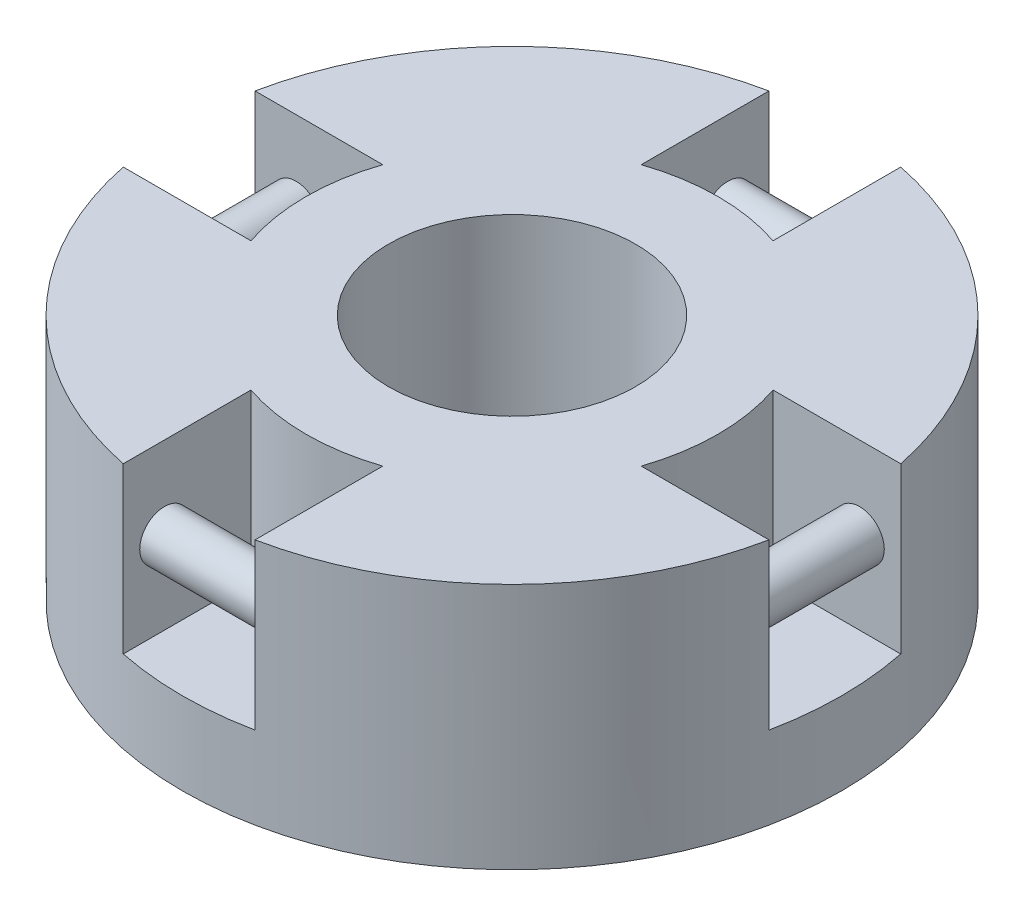
ISO-10303-21;
HEADER;
FILE_DESCRIPTION(('STEP AP214'),'2;1');
FILE_NAME('part.step','',(''),(''),'','','');
FILE_SCHEMA(('AUTOMOTIVE_DESIGN { 1 0 10303 214 1 1 1 1 }'));
ENDSEC;
DATA;
#1=APPLICATION_CONTEXT('core data for automotive mechanical design processes');
#2=APPLICATION_PROTOCOL_DEFINITION('international standard','automotive_design',2000,#1);
#3=PRODUCT_CONTEXT('',#1,'mechanical');
#4=PRODUCT('Part','Part','',(#3));
#5=PRODUCT_RELATED_PRODUCT_CATEGORY('part','',(#4));
#6=PRODUCT_DEFINITION_FORMATION('','',#4);
#7=PRODUCT_DEFINITION_CONTEXT('part definition',#1,'design');
#8=PRODUCT_DEFINITION('design','',#6,#7);
#9=PRODUCT_DEFINITION_SHAPE('','',#8);
#10=(LENGTH_UNIT() NAMED_UNIT(*) SI_UNIT(.MILLI.,.METRE.));
#11=(NAMED_UNIT(*) PLANE_ANGLE_UNIT() SI_UNIT($,.RADIAN.));
#12=(NAMED_UNIT(*) SI_UNIT($,.STERADIAN.) SOLID_ANGLE_UNIT());
#13=UNCERTAINTY_MEASURE_WITH_UNIT(LENGTH_MEASURE(1.E-05),#10,'distance_accuracy_value','');
#14=(GEOMETRIC_REPRESENTATION_CONTEXT(3) GLOBAL_UNCERTAINTY_ASSIGNED_CONTEXT((#13)) GLOBAL_UNIT_ASSIGNED_CONTEXT((#10,
#11,#12)) REPRESENTATION_CONTEXT('',''));
#15=CARTESIAN_POINT('',(0.,0.,0.));
#16=DIRECTION('',(0.,0.,1.));
#17=DIRECTION('',(1.,0.,0.));
#18=AXIS2_PLACEMENT_3D('',#15,#16,#17);
#19=CARTESIAN_POINT('',(0.,15.,0.));
#20=DIRECTION('',(0.,1.,0.));
#21=DIRECTION('',(0.,0.,1.));
#22=AXIS2_PLACEMENT_3D('',#19,#20,#21);
#23=PLANE('',#22);
#24=DIRECTION('',(0.,0.,-1.));
#25=VECTOR('',#24,1.);
#26=CARTESIAN_POINT('',(4.,15.,-19.5959179422654));
#27=LINE('',#26,#25);
#28=CARTESIAN_POINT('',(4.00000000000001,15.,-11.842719282327));
#29=VERTEX_POINT('',#28);
#30=CARTESIAN_POINT('',(4.,15.,-19.5959179422654));
#31=VERTEX_POINT('',#30);
#32=EDGE_CURVE('E168',#29,#31,#27,.T.);
#33=ORIENTED_EDGE('',*,*,#32,.F.);
#34=CARTESIAN_POINT('',(0.,15.,0.));
#35=DIRECTION('',(0.,-1.,0.));
#36=DIRECTION('',(0.,0.,1.));
#37=AXIS2_PLACEMENT_3D('',#34,#35,#36);
#38=CIRCLE('',#37,12.5);
#39=CARTESIAN_POINT('',(-3.99999999999999,15.,-11.842719282327));
#40=VERTEX_POINT('',#39);
#41=EDGE_CURVE('E574',#40,#29,#38,.T.);
#42=ORIENTED_EDGE('',*,*,#41,.F.);
#43=DIRECTION('',(0.,0.,1.));
#44=VECTOR('',#43,1.);
#45=CARTESIAN_POINT('',(-4.,15.,-19.5959179422654));
#46=LINE('',#45,#44);
#47=CARTESIAN_POINT('',(-4.,15.,-19.5959179422654));
#48=VERTEX_POINT('',#47);
#49=EDGE_CURVE('E201',#48,#40,#46,.T.);
#50=ORIENTED_EDGE('',*,*,#49,.F.);
#51=CARTESIAN_POINT('',(0.,15.,0.));
#52=DIRECTION('',(0.,1.,0.));
#53=DIRECTION('',(0.,0.,1.));
#54=AXIS2_PLACEMENT_3D('',#51,#52,#53);
#55=CIRCLE('',#54,20.);
#56=CARTESIAN_POINT('',(-19.5959179422654,15.,-4.));
#57=VERTEX_POINT('',#56);
#58=EDGE_CURVE('E174',#48,#57,#55,.T.);
#59=ORIENTED_EDGE('',*,*,#58,.T.);
#60=DIRECTION('',(-1.,0.,0.));
#61=VECTOR('',#60,1.);
#62=CARTESIAN_POINT('',(-19.5959179422654,15.,-4.));
#63=LINE('',#62,#61);
#64=CARTESIAN_POINT('',(-11.842719282327,15.,-4.));
#65=VERTEX_POINT('',#64);
#66=EDGE_CURVE('E184',#65,#57,#63,.T.);
#67=ORIENTED_EDGE('',*,*,#66,.F.);
#68=CARTESIAN_POINT('',(0.,15.,0.));
#69=DIRECTION('',(0.,-1.,0.));
#70=DIRECTION('',(0.,0.,1.));
#71=AXIS2_PLACEMENT_3D('',#68,#69,#70);
#72=CIRCLE('',#71,12.5);
#73=CARTESIAN_POINT('',(-11.842719282327,15.,4.));
#74=VERTEX_POINT('',#73);
#75=EDGE_CURVE('E194',#74,#65,#72,.T.);
#76=ORIENTED_EDGE('',*,*,#75,.F.);
#77=DIRECTION('',(1.,0.,0.));
#78=VECTOR('',#77,1.);
#79=CARTESIAN_POINT('',(-19.5959179422654,15.,4.));
#80=LINE('',#79,#78);
#81=CARTESIAN_POINT('',(-19.5959179422654,15.,4.));
#82=VERTEX_POINT('',#81);
#83=EDGE_CURVE('E191',#82,#74,#80,.T.);
#84=ORIENTED_EDGE('',*,*,#83,.F.);
#85=CARTESIAN_POINT('',(-4.,15.,19.5959179422654));
#86=VERTEX_POINT('',#85);
#87=EDGE_CURVE('E275',#82,#86,#55,.T.);
#88=ORIENTED_EDGE('',*,*,#87,.T.);
#89=DIRECTION('',(0.,0.,1.));
#90=VECTOR('',#89,1.);
#91=CARTESIAN_POINT('',(-3.99999999999999,15.,11.842719282327));
#92=LINE('',#91,#90);
#93=CARTESIAN_POINT('',(-3.99999999999999,15.,11.842719282327));
#94=VERTEX_POINT('',#93);
#95=EDGE_CURVE('E211',#94,#86,#92,.T.);
#96=ORIENTED_EDGE('',*,*,#95,.F.);
#97=CARTESIAN_POINT('',(0.,15.,0.));
#98=DIRECTION('',(0.,-1.,0.));
#99=DIRECTION('',(0.,0.,1.));
#100=AXIS2_PLACEMENT_3D('',#97,#98,#99);
#101=CIRCLE('',#100,12.5);
#102=CARTESIAN_POINT('',(4.,15.,11.842719282327));
#103=VERTEX_POINT('',#102);
#104=EDGE_CURVE('E223',#103,#94,#101,.T.);
#105=ORIENTED_EDGE('',*,*,#104,.F.);
#106=DIRECTION('',(0.,0.,-1.));
#107=VECTOR('',#106,1.);
#108=CARTESIAN_POINT('',(4.00000000000001,15.,11.842719282327));
#109=LINE('',#108,#107);
#110=CARTESIAN_POINT('',(4.,15.,19.5959179422654));
#111=VERTEX_POINT('',#110);
#112=EDGE_CURVE('E220',#111,#103,#109,.T.);
#113=ORIENTED_EDGE('',*,*,#112,.F.);
#114=CARTESIAN_POINT('',(19.5959179422654,15.,4.));
#115=VERTEX_POINT('',#114);
#116=EDGE_CURVE('E270',#111,#115,#55,.T.);
#117=ORIENTED_EDGE('',*,*,#116,.T.);
#118=DIRECTION('',(1.,0.,0.));
#119=VECTOR('',#118,1.);
#120=CARTESIAN_POINT('',(11.842719282327,15.,4.));
#121=LINE('',#120,#119);
#122=CARTESIAN_POINT('',(11.842719282327,15.,4.));
#123=VERTEX_POINT('',#122);
#124=EDGE_CURVE('E239',#123,#115,#121,.T.);
#125=ORIENTED_EDGE('',*,*,#124,.F.);
#126=CARTESIAN_POINT('',(0.,15.,0.));
#127=DIRECTION('',(0.,-1.,0.));
#128=DIRECTION('',(0.,0.,1.));
#129=AXIS2_PLACEMENT_3D('',#126,#127,#128);
#130=CIRCLE('',#129,12.5);
#131=CARTESIAN_POINT('',(11.842719282327,15.,-4.));
#132=VERTEX_POINT('',#131);
#133=EDGE_CURVE('E251',#132,#123,#130,.T.);
#134=ORIENTED_EDGE('',*,*,#133,.F.);
#135=DIRECTION('',(-1.,0.,0.));
#136=VECTOR('',#135,1.);
#137=CARTESIAN_POINT('',(11.842719282327,15.,-4.));
#138=LINE('',#137,#136);
#139=CARTESIAN_POINT('',(19.5959179422654,15.,-4.));
#140=VERTEX_POINT('',#139);
#141=EDGE_CURVE('E248',#140,#132,#138,.T.);
#142=ORIENTED_EDGE('',*,*,#141,.F.);
#143=EDGE_CURVE('E274',#140,#31,#55,.T.);
#144=ORIENTED_EDGE('',*,*,#143,.T.);
#145=EDGE_LOOP('',(#33,#42,#50,#59,#67,#76,#84,#88,#96,#105,#113,#117,#125,#134,#142,#144));
#146=FACE_BOUND('',#145,.T.);
#147=CARTESIAN_POINT('',(0.,15.,0.));
#148=DIRECTION('',(0.,1.,0.));
#149=DIRECTION('',(0.,0.,1.));
#150=AXIS2_PLACEMENT_3D('',#147,#148,#149);
#151=CIRCLE('',#150,7.5);
#152=CARTESIAN_POINT('',(0.,15.,7.5));
#153=VERTEX_POINT('',#152);
#154=EDGE_CURVE('E262',#153,#153,#151,.T.);
#155=ORIENTED_EDGE('',*,*,#154,.F.);
#156=EDGE_LOOP('',(#155));
#157=FACE_BOUND('',#156,.T.);
#158=ADVANCED_FACE('F37',(#146,#157),#23,.T.);
#159=CARTESIAN_POINT('',(0.,0.,0.));
#160=DIRECTION('',(0.,1.,0.));
#161=DIRECTION('',(0.,0.,1.));
#162=AXIS2_PLACEMENT_3D('',#159,#160,#161);
#163=PLANE('',#162);
#164=CARTESIAN_POINT('',(0.,0.,0.));
#165=DIRECTION('',(0.,1.,0.));
#166=DIRECTION('',(0.,0.,1.));
#167=AXIS2_PLACEMENT_3D('',#164,#165,#166);
#168=CIRCLE('',#167,20.);
#169=CARTESIAN_POINT('',(0.,0.,20.));
#170=VERTEX_POINT('',#169);
#171=EDGE_CURVE('E265',#170,#170,#168,.T.);
#172=ORIENTED_EDGE('',*,*,#171,.F.);
#173=EDGE_LOOP('',(#172));
#174=FACE_BOUND('',#173,.T.);
#175=CARTESIAN_POINT('',(0.,0.,0.));
#176=DIRECTION('',(0.,1.,0.));
#177=DIRECTION('',(0.,0.,1.));
#178=AXIS2_PLACEMENT_3D('',#175,#176,#177);
#179=CIRCLE('',#178,7.5);
#180=CARTESIAN_POINT('',(0.,0.,7.5));
#181=VERTEX_POINT('',#180);
#182=EDGE_CURVE('E266',#181,#181,#179,.T.);
#183=ORIENTED_EDGE('',*,*,#182,.T.);
#184=EDGE_LOOP('',(#183));
#185=FACE_BOUND('',#184,.T.);
#186=ADVANCED_FACE('F358',(#174,#185),#163,.F.);
#187=CARTESIAN_POINT('',(0.,15.,0.));
#188=DIRECTION('',(0.,-1.,0.));
#189=DIRECTION('',(0.,0.,-1.));
#190=AXIS2_PLACEMENT_3D('',#187,#188,#189);
#191=CYLINDRICAL_SURFACE('',#190,20.);
#192=CARTESIAN_POINT('',(0.,5.,0.));
#193=DIRECTION('',(0.,1.,0.));
#194=DIRECTION('',(0.,0.,1.));
#195=AXIS2_PLACEMENT_3D('',#192,#193,#194);
#196=CIRCLE('',#195,20.);
#197=CARTESIAN_POINT('',(4.,5.,-19.5959179422654));
#198=VERTEX_POINT('',#197);
#199=CARTESIAN_POINT('',(-4.,5.,-19.5959179422654));
#200=VERTEX_POINT('',#199);
#201=EDGE_CURVE('E162',#198,#200,#196,.T.);
#202=ORIENTED_EDGE('',*,*,#201,.F.);
#203=DIRECTION('',(0.,1.,0.));
#204=VECTOR('',#203,1.);
#205=CARTESIAN_POINT('',(4.,5.,-19.5959179422654));
#206=LINE('',#205,#204);
#207=EDGE_CURVE('E269',#198,#31,#206,.T.);
#208=ORIENTED_EDGE('',*,*,#207,.T.);
#209=ORIENTED_EDGE('',*,*,#143,.F.);
#210=DIRECTION('',(0.,1.,0.));
#211=VECTOR('',#210,1.);
#212=CARTESIAN_POINT('',(19.5959179422654,5.,-4.));
#213=LINE('',#212,#211);
#214=CARTESIAN_POINT('',(19.5959179422654,5.,-4.));
#215=VERTEX_POINT('',#214);
#216=EDGE_CURVE('E247',#215,#140,#213,.T.);
#217=ORIENTED_EDGE('',*,*,#216,.F.);
#218=CARTESIAN_POINT('',(0.,5.,0.));
#219=DIRECTION('',(0.,1.,0.));
#220=DIRECTION('',(0.,0.,1.));
#221=AXIS2_PLACEMENT_3D('',#218,#219,#220);
#222=CIRCLE('',#221,20.);
#223=CARTESIAN_POINT('',(19.5959179422654,5.,4.));
#224=VERTEX_POINT('',#223);
#225=EDGE_CURVE('E235',#224,#215,#222,.T.);
#226=ORIENTED_EDGE('',*,*,#225,.F.);
#227=DIRECTION('',(0.,1.,0.));
#228=VECTOR('',#227,1.);
#229=CARTESIAN_POINT('',(19.5959179422654,5.,4.));
#230=LINE('',#229,#228);
#231=EDGE_CURVE('E224',#224,#115,#230,.T.);
#232=ORIENTED_EDGE('',*,*,#231,.T.);
#233=ORIENTED_EDGE('',*,*,#116,.F.);
#234=DIRECTION('',(0.,1.,0.));
#235=VECTOR('',#234,1.);
#236=CARTESIAN_POINT('',(4.,5.,19.5959179422654));
#237=LINE('',#236,#235);
#238=CARTESIAN_POINT('',(4.,5.,19.5959179422654));
#239=VERTEX_POINT('',#238);
#240=EDGE_CURVE('E219',#239,#111,#237,.T.);
#241=ORIENTED_EDGE('',*,*,#240,.F.);
#242=CARTESIAN_POINT('',(0.,5.,0.));
#243=DIRECTION('',(0.,1.,0.));
#244=DIRECTION('',(0.,0.,1.));
#245=AXIS2_PLACEMENT_3D('',#242,#243,#244);
#246=CIRCLE('',#245,20.);
#247=CARTESIAN_POINT('',(-4.,5.,19.5959179422654));
#248=VERTEX_POINT('',#247);
#249=EDGE_CURVE('E207',#248,#239,#246,.T.);
#250=ORIENTED_EDGE('',*,*,#249,.F.);
#251=DIRECTION('',(0.,1.,0.));
#252=VECTOR('',#251,1.);
#253=CARTESIAN_POINT('',(-4.,5.,19.5959179422654));
#254=LINE('',#253,#252);
#255=EDGE_CURVE('E195',#248,#86,#254,.T.);
#256=ORIENTED_EDGE('',*,*,#255,.T.);
#257=ORIENTED_EDGE('',*,*,#87,.F.);
#258=DIRECTION('',(0.,1.,0.));
#259=VECTOR('',#258,1.);
#260=CARTESIAN_POINT('',(-19.5959179422654,5.,4.));
#261=LINE('',#260,#259);
#262=CARTESIAN_POINT('',(-19.5959179422654,5.,4.));
#263=VERTEX_POINT('',#262);
#264=EDGE_CURVE('E190',#263,#82,#261,.T.);
#265=ORIENTED_EDGE('',*,*,#264,.F.);
#266=CARTESIAN_POINT('',(0.,5.,0.));
#267=DIRECTION('',(0.,1.,0.));
#268=DIRECTION('',(0.,0.,1.));
#269=AXIS2_PLACEMENT_3D('',#266,#267,#268);
#270=CIRCLE('',#269,20.);
#271=CARTESIAN_POINT('',(-19.5959179422654,5.,-4.));
#272=VERTEX_POINT('',#271);
#273=EDGE_CURVE('E181',#272,#263,#270,.T.);
#274=ORIENTED_EDGE('',*,*,#273,.F.);
#275=DIRECTION('',(0.,1.,0.));
#276=VECTOR('',#275,1.);
#277=CARTESIAN_POINT('',(-19.5959179422654,5.,-4.));
#278=LINE('',#277,#276);
#279=EDGE_CURVE('E199',#272,#57,#278,.T.);
#280=ORIENTED_EDGE('',*,*,#279,.T.);
#281=ORIENTED_EDGE('',*,*,#58,.F.);
#282=DIRECTION('',(0.,1.,0.));
#283=VECTOR('',#282,1.);
#284=CARTESIAN_POINT('',(-4.,5.,-19.5959179422654));
#285=LINE('',#284,#283);
#286=EDGE_CURVE('E157',#200,#48,#285,.T.);
#287=ORIENTED_EDGE('',*,*,#286,.F.);
#288=EDGE_LOOP('',(#202,#208,#209,#217,#226,#232,#233,#241,#250,#256,#257,#265,#274,#280,#281,#287));
#289=FACE_BOUND('',#288,.T.);
#290=ORIENTED_EDGE('',*,*,#171,.T.);
#291=EDGE_LOOP('',(#290));
#292=FACE_BOUND('',#291,.T.);
#293=ADVANCED_FACE('F39',(#289,#292),#191,.T.);
#294=CARTESIAN_POINT('',(0.,15.,0.));
#295=DIRECTION('',(0.,-1.,0.));
#296=DIRECTION('',(0.,0.,-1.));
#297=AXIS2_PLACEMENT_3D('',#294,#295,#296);
#298=CYLINDRICAL_SURFACE('',#297,7.5);
#299=ORIENTED_EDGE('',*,*,#154,.T.);
#300=EDGE_LOOP('',(#299));
#301=FACE_BOUND('',#300,.T.);
#302=ORIENTED_EDGE('',*,*,#182,.F.);
#303=EDGE_LOOP('',(#302));
#304=FACE_BOUND('',#303,.T.);
#305=ADVANCED_FACE('F365',(#301,#304),#298,.F.);
#306=CARTESIAN_POINT('',(11.842719282327,5.,4.));
#307=DIRECTION('',(0.,0.,1.));
#308=DIRECTION('',(1.,0.,0.));
#309=AXIS2_PLACEMENT_3D('',#306,#307,#308);
#310=PLANE('',#309);
#311=CARTESIAN_POINT('',(17.0959179422654,10.,4.));
#312=DIRECTION('',(0.,0.,1.));
#313=DIRECTION('',(1.,0.,0.));
#314=AXIS2_PLACEMENT_3D('',#311,#312,#313);
#315=CIRCLE('',#314,1.5);
#316=CARTESIAN_POINT('',(18.5959179422654,10.,4.));
#317=VERTEX_POINT('',#316);
#318=EDGE_CURVE('E280',#317,#317,#315,.F.);
#319=ORIENTED_EDGE('',*,*,#318,.F.);
#320=EDGE_LOOP('',(#319));
#321=FACE_BOUND('',#320,.T.);
#322=ORIENTED_EDGE('',*,*,#124,.T.);
#323=ORIENTED_EDGE('',*,*,#231,.F.);
#324=DIRECTION('',(1.,0.,0.));
#325=VECTOR('',#324,1.);
#326=CARTESIAN_POINT('',(11.842719282327,5.,4.));
#327=LINE('',#326,#325);
#328=CARTESIAN_POINT('',(11.842719282327,5.,4.));
#329=VERTEX_POINT('',#328);
#330=EDGE_CURVE('E245',#329,#224,#327,.T.);
#331=ORIENTED_EDGE('',*,*,#330,.F.);
#332=DIRECTION('',(0.,1.,0.));
#333=VECTOR('',#332,1.);
#334=CARTESIAN_POINT('',(11.842719282327,5.,4.));
#335=LINE('',#334,#333);
#336=EDGE_CURVE('E257',#329,#123,#335,.T.);
#337=ORIENTED_EDGE('',*,*,#336,.T.);
#338=EDGE_LOOP('',(#322,#323,#331,#337));
#339=FACE_BOUND('',#338,.T.);
#340=ADVANCED_FACE('F326',(#321,#339),#310,.F.);
#341=CARTESIAN_POINT('',(0.,5.,0.));
#342=DIRECTION('',(0.,1.,0.));
#343=DIRECTION('',(0.,0.,1.));
#344=AXIS2_PLACEMENT_3D('',#341,#342,#343);
#345=CYLINDRICAL_SURFACE('',#344,12.5);
#346=ORIENTED_EDGE('',*,*,#133,.T.);
#347=ORIENTED_EDGE('',*,*,#336,.F.);
#348=CARTESIAN_POINT('',(0.,5.,0.));
#349=DIRECTION('',(0.,-1.,0.));
#350=DIRECTION('',(0.,0.,1.));
#351=AXIS2_PLACEMENT_3D('',#348,#349,#350);
#352=CIRCLE('',#351,12.5);
#353=CARTESIAN_POINT('',(11.842719282327,5.,-4.));
#354=VERTEX_POINT('',#353);
#355=EDGE_CURVE('E242',#354,#329,#352,.T.);
#356=ORIENTED_EDGE('',*,*,#355,.F.);
#357=DIRECTION('',(0.,1.,0.));
#358=VECTOR('',#357,1.);
#359=CARTESIAN_POINT('',(11.842719282327,5.,-4.));
#360=LINE('',#359,#358);
#361=EDGE_CURVE('E259',#354,#132,#360,.T.);
#362=ORIENTED_EDGE('',*,*,#361,.T.);
#363=EDGE_LOOP('',(#346,#347,#356,#362));
#364=FACE_BOUND('',#363,.T.);
#365=ADVANCED_FACE('F330',(#364),#345,.T.);
#366=CARTESIAN_POINT('',(11.842719282327,5.,-4.));
#367=DIRECTION('',(0.,0.,-1.));
#368=DIRECTION('',(-1.,0.,0.));
#369=AXIS2_PLACEMENT_3D('',#366,#367,#368);
#370=PLANE('',#369);
#371=CARTESIAN_POINT('',(17.0959179422654,10.,-4.));
#372=DIRECTION('',(0.,0.,-1.));
#373=DIRECTION('',(-1.,0.,0.));
#374=AXIS2_PLACEMENT_3D('',#371,#372,#373);
#375=CIRCLE('',#374,1.5);
#376=CARTESIAN_POINT('',(15.5959179422654,10.,-4.));
#377=VERTEX_POINT('',#376);
#378=EDGE_CURVE('E273',#377,#377,#375,.F.);
#379=ORIENTED_EDGE('',*,*,#378,.F.);
#380=EDGE_LOOP('',(#379));
#381=FACE_BOUND('',#380,.T.);
#382=ORIENTED_EDGE('',*,*,#141,.T.);
#383=ORIENTED_EDGE('',*,*,#361,.F.);
#384=DIRECTION('',(-1.,0.,0.));
#385=VECTOR('',#384,1.);
#386=CARTESIAN_POINT('',(11.842719282327,5.,-4.));
#387=LINE('',#386,#385);
#388=EDGE_CURVE('E238',#215,#354,#387,.T.);
#389=ORIENTED_EDGE('',*,*,#388,.F.);
#390=ORIENTED_EDGE('',*,*,#216,.T.);
#391=EDGE_LOOP('',(#382,#383,#389,#390));
#392=FACE_BOUND('',#391,.T.);
#393=ADVANCED_FACE('F332',(#381,#392),#370,.F.);
#394=CARTESIAN_POINT('',(0.,5.,0.));
#395=DIRECTION('',(0.,1.,0.));
#396=DIRECTION('',(0.,0.,1.));
#397=AXIS2_PLACEMENT_3D('',#394,#395,#396);
#398=PLANE('',#397);
#399=ORIENTED_EDGE('',*,*,#225,.T.);
#400=ORIENTED_EDGE('',*,*,#388,.T.);
#401=ORIENTED_EDGE('',*,*,#355,.T.);
#402=ORIENTED_EDGE('',*,*,#330,.T.);
#403=EDGE_LOOP('',(#399,#400,#401,#402));
#404=FACE_BOUND('',#403,.T.);
#405=ADVANCED_FACE('F345',(#404),#398,.T.);
#406=CARTESIAN_POINT('',(-3.99999999999999,5.,11.842719282327));
#407=DIRECTION('',(-1.,0.,0.));
#408=DIRECTION('',(0.,0.,1.));
#409=AXIS2_PLACEMENT_3D('',#406,#407,#408);
#410=PLANE('',#409);
#411=CARTESIAN_POINT('',(-4.,10.,17.0959179422655));
#412=DIRECTION('',(-1.,0.,0.));
#413=DIRECTION('',(0.,0.,1.));
#414=AXIS2_PLACEMENT_3D('',#411,#412,#413);
#415=CIRCLE('',#414,1.5);
#416=CARTESIAN_POINT('',(-4.,10.,18.5959179422655));
#417=VERTEX_POINT('',#416);
#418=EDGE_CURVE('E11',#417,#417,#415,.F.);
#419=ORIENTED_EDGE('',*,*,#418,.F.);
#420=EDGE_LOOP('',(#419));
#421=FACE_BOUND('',#420,.T.);
#422=ORIENTED_EDGE('',*,*,#95,.T.);
#423=ORIENTED_EDGE('',*,*,#255,.F.);
#424=DIRECTION('',(0.,0.,1.));
#425=VECTOR('',#424,1.);
#426=CARTESIAN_POINT('',(-3.99999999999999,5.,11.842719282327));
#427=LINE('',#426,#425);
#428=CARTESIAN_POINT('',(-3.99999999999999,5.,11.842719282327));
#429=VERTEX_POINT('',#428);
#430=EDGE_CURVE('E217',#429,#248,#427,.T.);
#431=ORIENTED_EDGE('',*,*,#430,.F.);
#432=DIRECTION('',(0.,1.,0.));
#433=VECTOR('',#432,1.);
#434=CARTESIAN_POINT('',(-3.99999999999999,5.,11.842719282327));
#435=LINE('',#434,#433);
#436=EDGE_CURVE('E230',#429,#94,#435,.T.);
#437=ORIENTED_EDGE('',*,*,#436,.T.);
#438=EDGE_LOOP('',(#422,#423,#431,#437));
#439=FACE_BOUND('',#438,.T.);
#440=ADVANCED_FACE('F343',(#421,#439),#410,.F.);
#441=CARTESIAN_POINT('',(0.,5.,0.));
#442=DIRECTION('',(0.,1.,0.));
#443=DIRECTION('',(0.,0.,1.));
#444=AXIS2_PLACEMENT_3D('',#441,#442,#443);
#445=CYLINDRICAL_SURFACE('',#444,12.5);
#446=ORIENTED_EDGE('',*,*,#104,.T.);
#447=ORIENTED_EDGE('',*,*,#436,.F.);
#448=CARTESIAN_POINT('',(0.,5.,0.));
#449=DIRECTION('',(0.,-1.,0.));
#450=DIRECTION('',(0.,0.,1.));
#451=AXIS2_PLACEMENT_3D('',#448,#449,#450);
#452=CIRCLE('',#451,12.5);
#453=CARTESIAN_POINT('',(4.,5.,11.842719282327));
#454=VERTEX_POINT('',#453);
#455=EDGE_CURVE('E214',#454,#429,#452,.T.);
#456=ORIENTED_EDGE('',*,*,#455,.F.);
#457=DIRECTION('',(0.,1.,0.));
#458=VECTOR('',#457,1.);
#459=CARTESIAN_POINT('',(4.,5.,11.842719282327));
#460=LINE('',#459,#458);
#461=EDGE_CURVE('E232',#454,#103,#460,.T.);
#462=ORIENTED_EDGE('',*,*,#461,.T.);
#463=EDGE_LOOP('',(#446,#447,#456,#462));
#464=FACE_BOUND('',#463,.T.);
#465=ADVANCED_FACE('F303',(#464),#445,.T.);
#466=CARTESIAN_POINT('',(4.00000000000001,5.,11.842719282327));
#467=DIRECTION('',(1.,0.,0.));
#468=DIRECTION('',(0.,0.,-1.));
#469=AXIS2_PLACEMENT_3D('',#466,#467,#468);
#470=PLANE('',#469);
#471=CARTESIAN_POINT('',(4.,10.,17.0959179422654));
#472=DIRECTION('',(1.,0.,0.));
#473=DIRECTION('',(0.,0.,-1.));
#474=AXIS2_PLACEMENT_3D('',#471,#472,#473);
#475=CIRCLE('',#474,1.5);
#476=CARTESIAN_POINT('',(4.,10.,15.5959179422654));
#477=VERTEX_POINT('',#476);
#478=EDGE_CURVE('E45',#477,#477,#475,.F.);
#479=ORIENTED_EDGE('',*,*,#478,.F.);
#480=EDGE_LOOP('',(#479));
#481=FACE_BOUND('',#480,.T.);
#482=ORIENTED_EDGE('',*,*,#112,.T.);
#483=ORIENTED_EDGE('',*,*,#461,.F.);
#484=DIRECTION('',(0.,0.,-1.));
#485=VECTOR('',#484,1.);
#486=CARTESIAN_POINT('',(4.00000000000001,5.,11.842719282327));
#487=LINE('',#486,#485);
#488=EDGE_CURVE('E210',#239,#454,#487,.T.);
#489=ORIENTED_EDGE('',*,*,#488,.F.);
#490=ORIENTED_EDGE('',*,*,#240,.T.);
#491=EDGE_LOOP('',(#482,#483,#489,#490));
#492=FACE_BOUND('',#491,.T.);
#493=ADVANCED_FACE('F299',(#481,#492),#470,.F.);
#494=CARTESIAN_POINT('',(0.,5.,0.));
#495=DIRECTION('',(0.,1.,0.));
#496=DIRECTION('',(0.,0.,1.));
#497=AXIS2_PLACEMENT_3D('',#494,#495,#496);
#498=PLANE('',#497);
#499=ORIENTED_EDGE('',*,*,#249,.T.);
#500=ORIENTED_EDGE('',*,*,#488,.T.);
#501=ORIENTED_EDGE('',*,*,#455,.T.);
#502=ORIENTED_EDGE('',*,*,#430,.T.);
#503=EDGE_LOOP('',(#499,#500,#501,#502));
#504=FACE_BOUND('',#503,.T.);
#505=ADVANCED_FACE('F302',(#504),#498,.T.);
#506=CARTESIAN_POINT('',(-19.5959179422654,5.,-4.));
#507=DIRECTION('',(0.,0.,-1.));
#508=DIRECTION('',(-1.,0.,0.));
#509=AXIS2_PLACEMENT_3D('',#506,#507,#508);
#510=PLANE('',#509);
#511=CARTESIAN_POINT('',(-17.0959179422654,10.,-4.));
#512=DIRECTION('',(0.,0.,-1.));
#513=DIRECTION('',(-1.,0.,0.));
#514=AXIS2_PLACEMENT_3D('',#511,#512,#513);
#515=CIRCLE('',#514,1.5);
#516=CARTESIAN_POINT('',(-18.5959179422654,10.,-4.));
#517=VERTEX_POINT('',#516);
#518=EDGE_CURVE('E292',#517,#517,#515,.F.);
#519=ORIENTED_EDGE('',*,*,#518,.F.);
#520=EDGE_LOOP('',(#519));
#521=FACE_BOUND('',#520,.T.);
#522=ORIENTED_EDGE('',*,*,#66,.T.);
#523=ORIENTED_EDGE('',*,*,#279,.F.);
#524=DIRECTION('',(-1.,0.,0.));
#525=VECTOR('',#524,1.);
#526=CARTESIAN_POINT('',(-19.5959179422654,5.,-4.));
#527=LINE('',#526,#525);
#528=CARTESIAN_POINT('',(-11.842719282327,5.,-4.));
#529=VERTEX_POINT('',#528);
#530=EDGE_CURVE('E60',#529,#272,#527,.T.);
#531=ORIENTED_EDGE('',*,*,#530,.F.);
#532=DIRECTION('',(0.,1.,0.));
#533=VECTOR('',#532,1.);
#534=CARTESIAN_POINT('',(-11.842719282327,5.,-4.));
#535=LINE('',#534,#533);
#536=EDGE_CURVE('E202',#529,#65,#535,.T.);
#537=ORIENTED_EDGE('',*,*,#536,.T.);
#538=EDGE_LOOP('',(#522,#523,#531,#537));
#539=FACE_BOUND('',#538,.T.);
#540=ADVANCED_FACE('F411',(#521,#539),#510,.F.);
#541=CARTESIAN_POINT('',(0.,5.,0.));
#542=DIRECTION('',(0.,1.,0.));
#543=DIRECTION('',(0.,0.,1.));
#544=AXIS2_PLACEMENT_3D('',#541,#542,#543);
#545=CYLINDRICAL_SURFACE('',#544,12.5);
#546=ORIENTED_EDGE('',*,*,#75,.T.);
#547=ORIENTED_EDGE('',*,*,#536,.F.);
#548=CARTESIAN_POINT('',(0.,5.,0.));
#549=DIRECTION('',(0.,-1.,0.));
#550=DIRECTION('',(0.,0.,1.));
#551=AXIS2_PLACEMENT_3D('',#548,#549,#550);
#552=CIRCLE('',#551,12.5);
#553=CARTESIAN_POINT('',(-11.842719282327,5.,4.));
#554=VERTEX_POINT('',#553);
#555=EDGE_CURVE('E187',#554,#529,#552,.T.);
#556=ORIENTED_EDGE('',*,*,#555,.F.);
#557=DIRECTION('',(0.,1.,0.));
#558=VECTOR('',#557,1.);
#559=CARTESIAN_POINT('',(-11.842719282327,5.,4.));
#560=LINE('',#559,#558);
#561=EDGE_CURVE('E204',#554,#74,#560,.T.);
#562=ORIENTED_EDGE('',*,*,#561,.T.);
#563=EDGE_LOOP('',(#546,#547,#556,#562));
#564=FACE_BOUND('',#563,.T.);
#565=ADVANCED_FACE('F414',(#564),#545,.T.);
#566=CARTESIAN_POINT('',(-19.5959179422654,5.,4.));
#567=DIRECTION('',(0.,0.,1.));
#568=DIRECTION('',(1.,0.,0.));
#569=AXIS2_PLACEMENT_3D('',#566,#567,#568);
#570=PLANE('',#569);
#571=CARTESIAN_POINT('',(-17.0959179422654,10.,4.));
#572=DIRECTION('',(0.,0.,1.));
#573=DIRECTION('',(1.,0.,0.));
#574=AXIS2_PLACEMENT_3D('',#571,#572,#573);
#575=CIRCLE('',#574,1.5);
#576=CARTESIAN_POINT('',(-15.5959179422654,10.,4.));
#577=VERTEX_POINT('',#576);
#578=EDGE_CURVE('E289',#577,#577,#575,.F.);
#579=ORIENTED_EDGE('',*,*,#578,.F.);
#580=EDGE_LOOP('',(#579));
#581=FACE_BOUND('',#580,.T.);
#582=ORIENTED_EDGE('',*,*,#83,.T.);
#583=ORIENTED_EDGE('',*,*,#561,.F.);
#584=DIRECTION('',(1.,0.,0.));
#585=VECTOR('',#584,1.);
#586=CARTESIAN_POINT('',(-19.5959179422654,5.,4.));
#587=LINE('',#586,#585);
#588=EDGE_CURVE('E183',#263,#554,#587,.T.);
#589=ORIENTED_EDGE('',*,*,#588,.F.);
#590=ORIENTED_EDGE('',*,*,#264,.T.);
#591=EDGE_LOOP('',(#582,#583,#589,#590));
#592=FACE_BOUND('',#591,.T.);
#593=ADVANCED_FACE('F410',(#581,#592),#570,.F.);
#594=CARTESIAN_POINT('',(0.,5.,0.));
#595=DIRECTION('',(0.,1.,0.));
#596=DIRECTION('',(0.,0.,1.));
#597=AXIS2_PLACEMENT_3D('',#594,#595,#596);
#598=PLANE('',#597);
#599=ORIENTED_EDGE('',*,*,#273,.T.);
#600=ORIENTED_EDGE('',*,*,#588,.T.);
#601=ORIENTED_EDGE('',*,*,#555,.T.);
#602=ORIENTED_EDGE('',*,*,#530,.T.);
#603=EDGE_LOOP('',(#599,#600,#601,#602));
#604=FACE_BOUND('',#603,.T.);
#605=ADVANCED_FACE('F400',(#604),#598,.T.);
#606=CARTESIAN_POINT('',(4.,5.,-19.5959179422654));
#607=DIRECTION('',(1.,0.,0.));
#608=DIRECTION('',(0.,0.,-1.));
#609=AXIS2_PLACEMENT_3D('',#606,#607,#608);
#610=PLANE('',#609);
#611=CARTESIAN_POINT('',(4.,10.,-17.0959179422654));
#612=DIRECTION('',(1.,0.,0.));
#613=DIRECTION('',(0.,0.,-1.));
#614=AXIS2_PLACEMENT_3D('',#611,#612,#613);
#615=CIRCLE('',#614,1.5);
#616=CARTESIAN_POINT('',(4.,10.,-18.5959179422654));
#617=VERTEX_POINT('',#616);
#618=EDGE_CURVE('E286',#617,#617,#615,.F.);
#619=ORIENTED_EDGE('',*,*,#618,.F.);
#620=EDGE_LOOP('',(#619));
#621=FACE_BOUND('',#620,.T.);
#622=ORIENTED_EDGE('',*,*,#32,.T.);
#623=ORIENTED_EDGE('',*,*,#207,.F.);
#624=DIRECTION('',(0.,0.,-1.));
#625=VECTOR('',#624,1.);
#626=CARTESIAN_POINT('',(4.,5.,-19.5959179422654));
#627=LINE('',#626,#625);
#628=CARTESIAN_POINT('',(4.00000000000001,5.,-11.842719282327));
#629=VERTEX_POINT('',#628);
#630=EDGE_CURVE('E52',#629,#198,#627,.T.);
#631=ORIENTED_EDGE('',*,*,#630,.F.);
#632=DIRECTION('',(0.,1.,0.));
#633=VECTOR('',#632,1.);
#634=CARTESIAN_POINT('',(4.00000000000001,5.,-11.842719282327));
#635=LINE('',#634,#633);
#636=EDGE_CURVE('E176',#629,#29,#635,.T.);
#637=ORIENTED_EDGE('',*,*,#636,.T.);
#638=EDGE_LOOP('',(#622,#623,#631,#637));
#639=FACE_BOUND('',#638,.T.);
#640=ADVANCED_FACE('F396',(#621,#639),#610,.F.);
#641=CARTESIAN_POINT('',(0.,5.,0.));
#642=DIRECTION('',(0.,1.,0.));
#643=DIRECTION('',(0.,0.,1.));
#644=AXIS2_PLACEMENT_3D('',#641,#642,#643);
#645=CYLINDRICAL_SURFACE('',#644,12.5);
#646=ORIENTED_EDGE('',*,*,#41,.T.);
#647=ORIENTED_EDGE('',*,*,#636,.F.);
#648=CARTESIAN_POINT('',(0.,5.,0.));
#649=DIRECTION('',(0.,-1.,0.));
#650=DIRECTION('',(0.,0.,1.));
#651=AXIS2_PLACEMENT_3D('',#648,#649,#650);
#652=CIRCLE('',#651,12.5);
#653=CARTESIAN_POINT('',(-3.99999999999999,5.,-11.842719282327));
#654=VERTEX_POINT('',#653);
#655=EDGE_CURVE('E161',#654,#629,#652,.T.);
#656=ORIENTED_EDGE('',*,*,#655,.F.);
#657=DIRECTION('',(0.,1.,0.));
#658=VECTOR('',#657,1.);
#659=CARTESIAN_POINT('',(-3.99999999999999,5.,-11.842719282327));
#660=LINE('',#659,#658);
#661=EDGE_CURVE('E159',#654,#40,#660,.T.);
#662=ORIENTED_EDGE('',*,*,#661,.T.);
#663=EDGE_LOOP('',(#646,#647,#656,#662));
#664=FACE_BOUND('',#663,.T.);
#665=ADVANCED_FACE('F399',(#664),#645,.T.);
#666=CARTESIAN_POINT('',(-4.,5.,-19.5959179422654));
#667=DIRECTION('',(-1.,0.,0.));
#668=DIRECTION('',(0.,0.,1.));
#669=AXIS2_PLACEMENT_3D('',#666,#667,#668);
#670=PLANE('',#669);
#671=CARTESIAN_POINT('',(-4.,10.,-17.0959179422654));
#672=DIRECTION('',(-1.,0.,0.));
#673=DIRECTION('',(0.,0.,1.));
#674=AXIS2_PLACEMENT_3D('',#671,#672,#673);
#675=CIRCLE('',#674,1.5);
#676=CARTESIAN_POINT('',(-4.,10.,-15.5959179422654));
#677=VERTEX_POINT('',#676);
#678=EDGE_CURVE('E283',#677,#677,#675,.F.);
#679=ORIENTED_EDGE('',*,*,#678,.F.);
#680=EDGE_LOOP('',(#679));
#681=FACE_BOUND('',#680,.T.);
#682=ORIENTED_EDGE('',*,*,#49,.T.);
#683=ORIENTED_EDGE('',*,*,#661,.F.);
#684=DIRECTION('',(0.,0.,1.));
#685=VECTOR('',#684,1.);
#686=CARTESIAN_POINT('',(-4.,5.,-19.5959179422654));
#687=LINE('',#686,#685);
#688=EDGE_CURVE('E153',#200,#654,#687,.T.);
#689=ORIENTED_EDGE('',*,*,#688,.F.);
#690=ORIENTED_EDGE('',*,*,#286,.T.);
#691=EDGE_LOOP('',(#682,#683,#689,#690));
#692=FACE_BOUND('',#691,.T.);
#693=ADVANCED_FACE('F155',(#681,#692),#670,.F.);
#694=CARTESIAN_POINT('',(0.,5.,0.));
#695=DIRECTION('',(0.,1.,0.));
#696=DIRECTION('',(0.,0.,1.));
#697=AXIS2_PLACEMENT_3D('',#694,#695,#696);
#698=PLANE('',#697);
#699=ORIENTED_EDGE('',*,*,#201,.T.);
#700=ORIENTED_EDGE('',*,*,#688,.T.);
#701=ORIENTED_EDGE('',*,*,#655,.T.);
#702=ORIENTED_EDGE('',*,*,#630,.T.);
#703=EDGE_LOOP('',(#699,#700,#701,#702));
#704=FACE_BOUND('',#703,.T.);
#705=ADVANCED_FACE('F165',(#704),#698,.T.);
#706=CARTESIAN_POINT('',(17.0959179422654,10.,-6.));
#707=DIRECTION('',(0.,0.,1.));
#708=DIRECTION('',(1.,0.,0.));
#709=AXIS2_PLACEMENT_3D('',#706,#707,#708);
#710=CYLINDRICAL_SURFACE('',#709,1.5);
#711=ORIENTED_EDGE('',*,*,#318,.T.);
#712=EDGE_LOOP('',(#711));
#713=FACE_BOUND('',#712,.T.);
#714=ORIENTED_EDGE('',*,*,#378,.T.);
#715=EDGE_LOOP('',(#714));
#716=FACE_BOUND('',#715,.T.);
#717=ADVANCED_FACE('F380',(#713,#716),#710,.T.);
#718=CARTESIAN_POINT('',(-6.00000000000006,10.,-17.0959179422654));
#719=DIRECTION('',(1.,0.,0.));
#720=DIRECTION('',(0.,0.,-1.));
#721=AXIS2_PLACEMENT_3D('',#718,#719,#720);
#722=CYLINDRICAL_SURFACE('',#721,1.5);
#723=ORIENTED_EDGE('',*,*,#618,.T.);
#724=EDGE_LOOP('',(#723));
#725=FACE_BOUND('',#724,.T.);
#726=ORIENTED_EDGE('',*,*,#678,.T.);
#727=EDGE_LOOP('',(#726));
#728=FACE_BOUND('',#727,.T.);
#729=ADVANCED_FACE('F383',(#725,#728),#722,.T.);
#730=CARTESIAN_POINT('',(-17.0959179422654,10.,6.));
#731=DIRECTION('',(0.,0.,-1.));
#732=DIRECTION('',(-1.,0.,0.));
#733=AXIS2_PLACEMENT_3D('',#730,#731,#732);
#734=CYLINDRICAL_SURFACE('',#733,1.5);
#735=ORIENTED_EDGE('',*,*,#518,.T.);
#736=EDGE_LOOP('',(#735));
#737=FACE_BOUND('',#736,.T.);
#738=ORIENTED_EDGE('',*,*,#578,.T.);
#739=EDGE_LOOP('',(#738));
#740=FACE_BOUND('',#739,.T.);
#741=ADVANCED_FACE('F390',(#737,#740),#734,.T.);
#742=CARTESIAN_POINT('',(6.00000000000018,10.,17.0959179422654));
#743=DIRECTION('',(-1.,0.,0.));
#744=DIRECTION('',(0.,0.,1.));
#745=AXIS2_PLACEMENT_3D('',#742,#743,#744);
#746=CYLINDRICAL_SURFACE('',#745,1.5);
#747=ORIENTED_EDGE('',*,*,#418,.T.);
#748=EDGE_LOOP('',(#747));
#749=FACE_BOUND('',#748,.T.);
#750=ORIENTED_EDGE('',*,*,#478,.T.);
#751=EDGE_LOOP('',(#750));
#752=FACE_BOUND('',#751,.T.);
#753=ADVANCED_FACE('F297',(#749,#752),#746,.T.);
#754=CLOSED_SHELL('',(#158,#186,#293,#305,#340,#365,#393,#405,#440,#465,#493,#505,#540,#565,
#593,#605,#640,#665,#693,#705,#717,#729,#741,#753));
#755=MANIFOLD_SOLID_BREP('B2',#754);
#756=ADVANCED_BREP_SHAPE_REPRESENTATION('',(#18,#755),#14);
#757=SHAPE_DEFINITION_REPRESENTATION(#9,#756);
ENDSEC;
END-ISO-10303-21;
